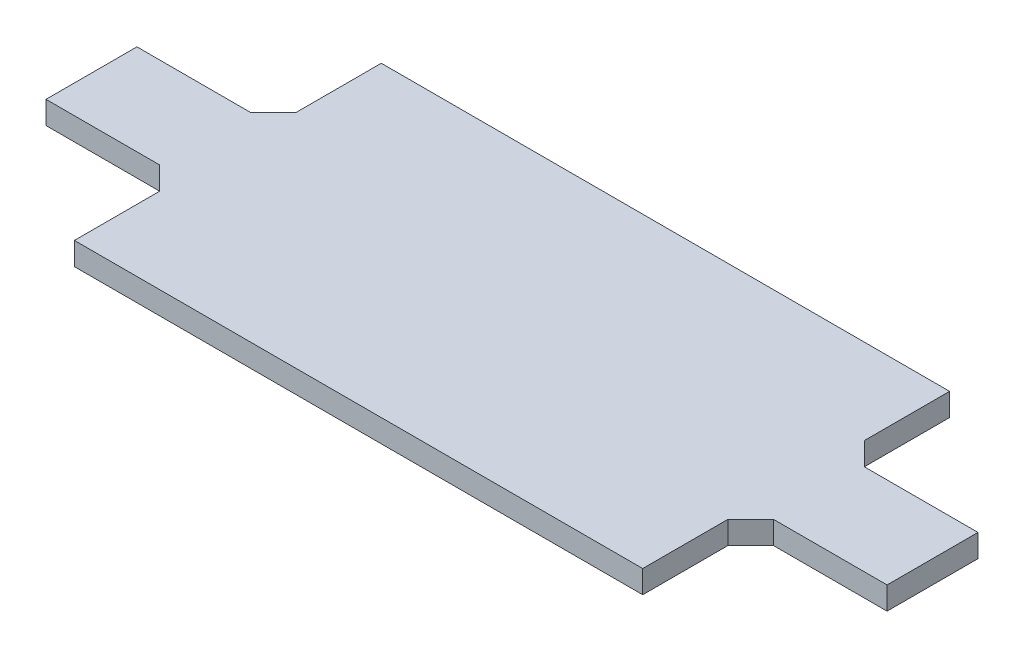
ISO-10303-21;
HEADER;
FILE_DESCRIPTION(('STEP AP214'),'2;1');
FILE_NAME('part.step','',(''),(''),'','','');
FILE_SCHEMA(('AUTOMOTIVE_DESIGN { 1 0 10303 214 1 1 1 1 }'));
ENDSEC;
DATA;
#1=APPLICATION_CONTEXT('core data for automotive mechanical design processes');
#2=APPLICATION_PROTOCOL_DEFINITION('international standard','automotive_design',2000,#1);
#3=PRODUCT_CONTEXT('',#1,'mechanical');
#4=PRODUCT('Part','Part','',(#3));
#5=PRODUCT_RELATED_PRODUCT_CATEGORY('part','',(#4));
#6=PRODUCT_DEFINITION_FORMATION('','',#4);
#7=PRODUCT_DEFINITION_CONTEXT('part definition',#1,'design');
#8=PRODUCT_DEFINITION('design','',#6,#7);
#9=PRODUCT_DEFINITION_SHAPE('','',#8);
#10=(LENGTH_UNIT() NAMED_UNIT(*) SI_UNIT(.MILLI.,.METRE.));
#11=(NAMED_UNIT(*) PLANE_ANGLE_UNIT() SI_UNIT($,.RADIAN.));
#12=(NAMED_UNIT(*) SI_UNIT($,.STERADIAN.) SOLID_ANGLE_UNIT());
#13=UNCERTAINTY_MEASURE_WITH_UNIT(LENGTH_MEASURE(1.E-05),#10,'distance_accuracy_value','');
#14=(GEOMETRIC_REPRESENTATION_CONTEXT(3) GLOBAL_UNCERTAINTY_ASSIGNED_CONTEXT((#13)) GLOBAL_UNIT_ASSIGNED_CONTEXT((#10,
#11,#12)) REPRESENTATION_CONTEXT('',''));
#15=CARTESIAN_POINT('',(0.,0.,0.));
#16=DIRECTION('',(0.,0.,1.));
#17=DIRECTION('',(1.,0.,0.));
#18=AXIS2_PLACEMENT_3D('',#15,#16,#17);
#19=CARTESIAN_POINT('',(-125.,10.,67.5));
#20=DIRECTION('',(0.,0.,-1.));
#21=DIRECTION('',(-1.,0.,0.));
#22=AXIS2_PLACEMENT_3D('',#19,#20,#21);
#23=PLANE('',#22);
#24=DIRECTION('',(1.,0.,0.));
#25=VECTOR('',#24,1.);
#26=CARTESIAN_POINT('',(-125.,0.,67.5));
#27=LINE('',#26,#25);
#28=CARTESIAN_POINT('',(-125.,0.,67.5));
#29=VERTEX_POINT('',#28);
#30=CARTESIAN_POINT('',(125.,0.,67.5));
#31=VERTEX_POINT('',#30);
#32=EDGE_CURVE('E182',#29,#31,#27,.T.);
#33=ORIENTED_EDGE('',*,*,#32,.T.);
#34=DIRECTION('',(0.,-1.,0.));
#35=VECTOR('',#34,1.);
#36=CARTESIAN_POINT('',(125.,10.,67.5));
#37=LINE('',#36,#35);
#38=CARTESIAN_POINT('',(125.,10.,67.5));
#39=VERTEX_POINT('',#38);
#40=EDGE_CURVE('E161',#39,#31,#37,.T.);
#41=ORIENTED_EDGE('',*,*,#40,.F.);
#42=DIRECTION('',(1.,0.,0.));
#43=VECTOR('',#42,1.);
#44=CARTESIAN_POINT('',(-125.,10.,67.5));
#45=LINE('',#44,#43);
#46=CARTESIAN_POINT('',(-125.,10.,67.5));
#47=VERTEX_POINT('',#46);
#48=EDGE_CURVE('E169',#47,#39,#45,.T.);
#49=ORIENTED_EDGE('',*,*,#48,.F.);
#50=DIRECTION('',(0.,-1.,0.));
#51=VECTOR('',#50,1.);
#52=CARTESIAN_POINT('',(-125.,10.,67.5));
#53=LINE('',#52,#51);
#54=EDGE_CURVE('E288',#47,#29,#53,.T.);
#55=ORIENTED_EDGE('',*,*,#54,.T.);
#56=EDGE_LOOP('',(#33,#41,#49,#55));
#57=FACE_BOUND('',#56,.T.);
#58=ADVANCED_FACE('F41',(#57),#23,.F.);
#59=CARTESIAN_POINT('',(125.,10.,20.));
#60=DIRECTION('',(-1.,0.,0.));
#61=DIRECTION('',(0.,0.,1.));
#62=AXIS2_PLACEMENT_3D('',#59,#60,#61);
#63=PLANE('',#62);
#64=DIRECTION('',(0.,0.,-1.));
#65=VECTOR('',#64,1.);
#66=CARTESIAN_POINT('',(125.,0.,20.));
#67=LINE('',#66,#65);
#68=CARTESIAN_POINT('',(125.,0.,30.));
#69=VERTEX_POINT('',#68);
#70=EDGE_CURVE('E249',#31,#69,#67,.T.);
#71=ORIENTED_EDGE('',*,*,#70,.T.);
#72=DIRECTION('',(0.,1.,0.));
#73=VECTOR('',#72,1.);
#74=CARTESIAN_POINT('',(125.,10.,30.));
#75=LINE('',#74,#73);
#76=CARTESIAN_POINT('',(125.,10.,30.));
#77=VERTEX_POINT('',#76);
#78=EDGE_CURVE('E164',#69,#77,#75,.T.);
#79=ORIENTED_EDGE('',*,*,#78,.T.);
#80=DIRECTION('',(0.,0.,-1.));
#81=VECTOR('',#80,1.);
#82=CARTESIAN_POINT('',(125.,10.,20.));
#83=LINE('',#82,#81);
#84=EDGE_CURVE('E156',#39,#77,#83,.T.);
#85=ORIENTED_EDGE('',*,*,#84,.F.);
#86=ORIENTED_EDGE('',*,*,#40,.T.);
#87=EDGE_LOOP('',(#71,#79,#85,#86));
#88=FACE_BOUND('',#87,.T.);
#89=ADVANCED_FACE('F159',(#88),#63,.F.);
#90=CARTESIAN_POINT('',(125.,10.,20.));
#91=DIRECTION('',(0.,0.,-1.));
#92=DIRECTION('',(-1.,0.,0.));
#93=AXIS2_PLACEMENT_3D('',#90,#91,#92);
#94=PLANE('',#93);
#95=DIRECTION('',(1.,0.,0.));
#96=VECTOR('',#95,1.);
#97=CARTESIAN_POINT('',(125.,10.,20.));
#98=LINE('',#97,#96);
#99=CARTESIAN_POINT('',(135.,10.,20.));
#100=VERTEX_POINT('',#99);
#101=CARTESIAN_POINT('',(185.,10.,20.));
#102=VERTEX_POINT('',#101);
#103=EDGE_CURVE('E168',#100,#102,#98,.T.);
#104=ORIENTED_EDGE('',*,*,#103,.F.);
#105=DIRECTION('',(0.,-1.,0.));
#106=VECTOR('',#105,1.);
#107=CARTESIAN_POINT('',(135.,0.,20.));
#108=LINE('',#107,#106);
#109=CARTESIAN_POINT('',(135.,0.,20.));
#110=VERTEX_POINT('',#109);
#111=EDGE_CURVE('E206',#100,#110,#108,.T.);
#112=ORIENTED_EDGE('',*,*,#111,.T.);
#113=DIRECTION('',(1.,0.,0.));
#114=VECTOR('',#113,1.);
#115=CARTESIAN_POINT('',(125.,0.,20.));
#116=LINE('',#115,#114);
#117=CARTESIAN_POINT('',(185.,0.,20.));
#118=VERTEX_POINT('',#117);
#119=EDGE_CURVE('E251',#110,#118,#116,.T.);
#120=ORIENTED_EDGE('',*,*,#119,.T.);
#121=DIRECTION('',(0.,-1.,0.));
#122=VECTOR('',#121,1.);
#123=CARTESIAN_POINT('',(185.,10.,20.));
#124=LINE('',#123,#122);
#125=EDGE_CURVE('E185',#102,#118,#124,.T.);
#126=ORIENTED_EDGE('',*,*,#125,.F.);
#127=EDGE_LOOP('',(#104,#112,#120,#126));
#128=FACE_BOUND('',#127,.T.);
#129=ADVANCED_FACE('F241',(#128),#94,.F.);
#130=CARTESIAN_POINT('',(185.,10.,20.));
#131=DIRECTION('',(-1.,0.,0.));
#132=DIRECTION('',(0.,0.,1.));
#133=AXIS2_PLACEMENT_3D('',#130,#131,#132);
#134=PLANE('',#133);
#135=DIRECTION('',(0.,0.,-1.));
#136=VECTOR('',#135,1.);
#137=CARTESIAN_POINT('',(185.,0.,20.));
#138=LINE('',#137,#136);
#139=CARTESIAN_POINT('',(185.,0.,-20.));
#140=VERTEX_POINT('',#139);
#141=EDGE_CURVE('E256',#118,#140,#138,.T.);
#142=ORIENTED_EDGE('',*,*,#141,.T.);
#143=DIRECTION('',(0.,-1.,0.));
#144=VECTOR('',#143,1.);
#145=CARTESIAN_POINT('',(185.,10.,-20.));
#146=LINE('',#145,#144);
#147=CARTESIAN_POINT('',(185.,10.,-20.));
#148=VERTEX_POINT('',#147);
#149=EDGE_CURVE('E193',#148,#140,#146,.T.);
#150=ORIENTED_EDGE('',*,*,#149,.F.);
#151=DIRECTION('',(0.,0.,-1.));
#152=VECTOR('',#151,1.);
#153=CARTESIAN_POINT('',(185.,10.,20.));
#154=LINE('',#153,#152);
#155=EDGE_CURVE('E245',#102,#148,#154,.T.);
#156=ORIENTED_EDGE('',*,*,#155,.F.);
#157=ORIENTED_EDGE('',*,*,#125,.T.);
#158=EDGE_LOOP('',(#142,#150,#156,#157));
#159=FACE_BOUND('',#158,.T.);
#160=ADVANCED_FACE('F312',(#159),#134,.F.);
#161=CARTESIAN_POINT('',(125.,10.,-20.));
#162=DIRECTION('',(0.,0.,1.));
#163=DIRECTION('',(1.,0.,0.));
#164=AXIS2_PLACEMENT_3D('',#161,#162,#163);
#165=PLANE('',#164);
#166=DIRECTION('',(-1.,0.,0.));
#167=VECTOR('',#166,1.);
#168=CARTESIAN_POINT('',(125.,0.,-20.));
#169=LINE('',#168,#167);
#170=CARTESIAN_POINT('',(135.,0.,-20.));
#171=VERTEX_POINT('',#170);
#172=EDGE_CURVE('E263',#140,#171,#169,.T.);
#173=ORIENTED_EDGE('',*,*,#172,.T.);
#174=DIRECTION('',(0.,1.,0.));
#175=VECTOR('',#174,1.);
#176=CARTESIAN_POINT('',(135.,10.,-20.));
#177=LINE('',#176,#175);
#178=CARTESIAN_POINT('',(135.,10.,-20.));
#179=VERTEX_POINT('',#178);
#180=EDGE_CURVE('E58',#171,#179,#177,.T.);
#181=ORIENTED_EDGE('',*,*,#180,.T.);
#182=DIRECTION('',(-1.,0.,0.));
#183=VECTOR('',#182,1.);
#184=CARTESIAN_POINT('',(125.,10.,-20.));
#185=LINE('',#184,#183);
#186=EDGE_CURVE('E310',#148,#179,#185,.T.);
#187=ORIENTED_EDGE('',*,*,#186,.F.);
#188=ORIENTED_EDGE('',*,*,#149,.T.);
#189=EDGE_LOOP('',(#173,#181,#187,#188));
#190=FACE_BOUND('',#189,.T.);
#191=ADVANCED_FACE('F309',(#190),#165,.F.);
#192=CARTESIAN_POINT('',(125.,10.,-67.5));
#193=DIRECTION('',(-1.,0.,0.));
#194=DIRECTION('',(0.,0.,1.));
#195=AXIS2_PLACEMENT_3D('',#192,#193,#194);
#196=PLANE('',#195);
#197=DIRECTION('',(0.,0.,-1.));
#198=VECTOR('',#197,1.);
#199=CARTESIAN_POINT('',(125.,10.,-67.5));
#200=LINE('',#199,#198);
#201=CARTESIAN_POINT('',(125.,10.,-30.0000000000001));
#202=VERTEX_POINT('',#201);
#203=CARTESIAN_POINT('',(125.,10.,-67.5));
#204=VERTEX_POINT('',#203);
#205=EDGE_CURVE('E316',#202,#204,#200,.T.);
#206=ORIENTED_EDGE('',*,*,#205,.F.);
#207=DIRECTION('',(0.,-1.,0.));
#208=VECTOR('',#207,1.);
#209=CARTESIAN_POINT('',(125.,0.,-30.0000000000001));
#210=LINE('',#209,#208);
#211=CARTESIAN_POINT('',(125.,0.,-30.0000000000001));
#212=VERTEX_POINT('',#211);
#213=EDGE_CURVE('E212',#202,#212,#210,.T.);
#214=ORIENTED_EDGE('',*,*,#213,.T.);
#215=DIRECTION('',(0.,0.,-1.));
#216=VECTOR('',#215,1.);
#217=CARTESIAN_POINT('',(125.,0.,-67.5));
#218=LINE('',#217,#216);
#219=CARTESIAN_POINT('',(125.,0.,-67.5));
#220=VERTEX_POINT('',#219);
#221=EDGE_CURVE('E266',#212,#220,#218,.T.);
#222=ORIENTED_EDGE('',*,*,#221,.T.);
#223=DIRECTION('',(0.,-1.,0.));
#224=VECTOR('',#223,1.);
#225=CARTESIAN_POINT('',(125.,10.,-67.5));
#226=LINE('',#225,#224);
#227=EDGE_CURVE('E303',#204,#220,#226,.T.);
#228=ORIENTED_EDGE('',*,*,#227,.F.);
#229=EDGE_LOOP('',(#206,#214,#222,#228));
#230=FACE_BOUND('',#229,.T.);
#231=ADVANCED_FACE('F377',(#230),#196,.F.);
#232=CARTESIAN_POINT('',(-125.,10.,-67.5));
#233=DIRECTION('',(0.,0.,1.));
#234=DIRECTION('',(1.,0.,0.));
#235=AXIS2_PLACEMENT_3D('',#232,#233,#234);
#236=PLANE('',#235);
#237=DIRECTION('',(-1.,0.,0.));
#238=VECTOR('',#237,1.);
#239=CARTESIAN_POINT('',(-125.,0.,-67.5));
#240=LINE('',#239,#238);
#241=CARTESIAN_POINT('',(-125.,0.,-67.5));
#242=VERTEX_POINT('',#241);
#243=EDGE_CURVE('E269',#220,#242,#240,.T.);
#244=ORIENTED_EDGE('',*,*,#243,.T.);
#245=DIRECTION('',(0.,-1.,0.));
#246=VECTOR('',#245,1.);
#247=CARTESIAN_POINT('',(-125.,10.,-67.5));
#248=LINE('',#247,#246);
#249=CARTESIAN_POINT('',(-125.,10.,-67.5));
#250=VERTEX_POINT('',#249);
#251=EDGE_CURVE('E299',#250,#242,#248,.T.);
#252=ORIENTED_EDGE('',*,*,#251,.F.);
#253=DIRECTION('',(-1.,0.,0.));
#254=VECTOR('',#253,1.);
#255=CARTESIAN_POINT('',(-125.,10.,-67.5));
#256=LINE('',#255,#254);
#257=EDGE_CURVE('E321',#204,#250,#256,.T.);
#258=ORIENTED_EDGE('',*,*,#257,.F.);
#259=ORIENTED_EDGE('',*,*,#227,.T.);
#260=EDGE_LOOP('',(#244,#252,#258,#259));
#261=FACE_BOUND('',#260,.T.);
#262=ADVANCED_FACE('F374',(#261),#236,.F.);
#263=CARTESIAN_POINT('',(-125.,10.,-67.5));
#264=DIRECTION('',(1.,0.,0.));
#265=DIRECTION('',(0.,0.,-1.));
#266=AXIS2_PLACEMENT_3D('',#263,#264,#265);
#267=PLANE('',#266);
#268=DIRECTION('',(0.,0.,1.));
#269=VECTOR('',#268,1.);
#270=CARTESIAN_POINT('',(-125.,0.,-67.5));
#271=LINE('',#270,#269);
#272=CARTESIAN_POINT('',(-125.,0.,-29.9999999999999));
#273=VERTEX_POINT('',#272);
#274=EDGE_CURVE('E272',#242,#273,#271,.T.);
#275=ORIENTED_EDGE('',*,*,#274,.T.);
#276=DIRECTION('',(0.,1.,0.));
#277=VECTOR('',#276,1.);
#278=CARTESIAN_POINT('',(-125.,10.,-29.9999999999999));
#279=LINE('',#278,#277);
#280=CARTESIAN_POINT('',(-125.,10.,-29.9999999999999));
#281=VERTEX_POINT('',#280);
#282=EDGE_CURVE('E203',#273,#281,#279,.T.);
#283=ORIENTED_EDGE('',*,*,#282,.T.);
#284=DIRECTION('',(0.,0.,1.));
#285=VECTOR('',#284,1.);
#286=CARTESIAN_POINT('',(-125.,10.,-67.5));
#287=LINE('',#286,#285);
#288=EDGE_CURVE('E324',#250,#281,#287,.T.);
#289=ORIENTED_EDGE('',*,*,#288,.F.);
#290=ORIENTED_EDGE('',*,*,#251,.T.);
#291=EDGE_LOOP('',(#275,#283,#289,#290));
#292=FACE_BOUND('',#291,.T.);
#293=ADVANCED_FACE('F368',(#292),#267,.F.);
#294=CARTESIAN_POINT('',(-125.,10.,-20.));
#295=DIRECTION('',(0.,0.,1.));
#296=DIRECTION('',(1.,0.,0.));
#297=AXIS2_PLACEMENT_3D('',#294,#295,#296);
#298=PLANE('',#297);
#299=DIRECTION('',(-1.,0.,0.));
#300=VECTOR('',#299,1.);
#301=CARTESIAN_POINT('',(-125.,10.,-20.));
#302=LINE('',#301,#300);
#303=CARTESIAN_POINT('',(-135.,10.,-20.));
#304=VERTEX_POINT('',#303);
#305=CARTESIAN_POINT('',(-185.,10.,-20.));
#306=VERTEX_POINT('',#305);
#307=EDGE_CURVE('E328',#304,#306,#302,.T.);
#308=ORIENTED_EDGE('',*,*,#307,.F.);
#309=DIRECTION('',(0.,-1.,0.));
#310=VECTOR('',#309,1.);
#311=CARTESIAN_POINT('',(-135.,0.,-20.));
#312=LINE('',#311,#310);
#313=CARTESIAN_POINT('',(-135.,0.,-20.));
#314=VERTEX_POINT('',#313);
#315=EDGE_CURVE('E199',#304,#314,#312,.T.);
#316=ORIENTED_EDGE('',*,*,#315,.T.);
#317=DIRECTION('',(-1.,0.,0.));
#318=VECTOR('',#317,1.);
#319=CARTESIAN_POINT('',(-125.,0.,-20.));
#320=LINE('',#319,#318);
#321=CARTESIAN_POINT('',(-185.,0.,-20.));
#322=VERTEX_POINT('',#321);
#323=EDGE_CURVE('E276',#314,#322,#320,.T.);
#324=ORIENTED_EDGE('',*,*,#323,.T.);
#325=DIRECTION('',(0.,-1.,0.));
#326=VECTOR('',#325,1.);
#327=CARTESIAN_POINT('',(-185.,10.,-20.));
#328=LINE('',#327,#326);
#329=EDGE_CURVE('E295',#306,#322,#328,.T.);
#330=ORIENTED_EDGE('',*,*,#329,.F.);
#331=EDGE_LOOP('',(#308,#316,#324,#330));
#332=FACE_BOUND('',#331,.T.);
#333=ADVANCED_FACE('F360',(#332),#298,.F.);
#334=CARTESIAN_POINT('',(-185.,10.,20.));
#335=DIRECTION('',(1.,0.,0.));
#336=DIRECTION('',(0.,0.,-1.));
#337=AXIS2_PLACEMENT_3D('',#334,#335,#336);
#338=PLANE('',#337);
#339=DIRECTION('',(0.,0.,1.));
#340=VECTOR('',#339,1.);
#341=CARTESIAN_POINT('',(-185.,0.,20.));
#342=LINE('',#341,#340);
#343=CARTESIAN_POINT('',(-185.,0.,20.));
#344=VERTEX_POINT('',#343);
#345=EDGE_CURVE('E279',#322,#344,#342,.T.);
#346=ORIENTED_EDGE('',*,*,#345,.T.);
#347=DIRECTION('',(0.,-1.,0.));
#348=VECTOR('',#347,1.);
#349=CARTESIAN_POINT('',(-185.,10.,20.));
#350=LINE('',#349,#348);
#351=CARTESIAN_POINT('',(-185.,10.,20.));
#352=VERTEX_POINT('',#351);
#353=EDGE_CURVE('E291',#352,#344,#350,.T.);
#354=ORIENTED_EDGE('',*,*,#353,.F.);
#355=DIRECTION('',(0.,0.,1.));
#356=VECTOR('',#355,1.);
#357=CARTESIAN_POINT('',(-185.,10.,20.));
#358=LINE('',#357,#356);
#359=EDGE_CURVE('E331',#306,#352,#358,.T.);
#360=ORIENTED_EDGE('',*,*,#359,.F.);
#361=ORIENTED_EDGE('',*,*,#329,.T.);
#362=EDGE_LOOP('',(#346,#354,#360,#361));
#363=FACE_BOUND('',#362,.T.);
#364=ADVANCED_FACE('F354',(#363),#338,.F.);
#365=CARTESIAN_POINT('',(-125.,10.,20.));
#366=DIRECTION('',(0.,0.,-1.));
#367=DIRECTION('',(-1.,0.,0.));
#368=AXIS2_PLACEMENT_3D('',#365,#366,#367);
#369=PLANE('',#368);
#370=DIRECTION('',(1.,0.,0.));
#371=VECTOR('',#370,1.);
#372=CARTESIAN_POINT('',(-125.,0.,20.));
#373=LINE('',#372,#371);
#374=CARTESIAN_POINT('',(-135.,0.,20.));
#375=VERTEX_POINT('',#374);
#376=EDGE_CURVE('E282',#344,#375,#373,.T.);
#377=ORIENTED_EDGE('',*,*,#376,.T.);
#378=DIRECTION('',(0.,1.,0.));
#379=VECTOR('',#378,1.);
#380=CARTESIAN_POINT('',(-135.,10.,20.));
#381=LINE('',#380,#379);
#382=CARTESIAN_POINT('',(-135.,10.,20.));
#383=VERTEX_POINT('',#382);
#384=EDGE_CURVE('E190',#375,#383,#381,.T.);
#385=ORIENTED_EDGE('',*,*,#384,.T.);
#386=DIRECTION('',(1.,0.,0.));
#387=VECTOR('',#386,1.);
#388=CARTESIAN_POINT('',(-125.,10.,20.));
#389=LINE('',#388,#387);
#390=EDGE_CURVE('E334',#352,#383,#389,.T.);
#391=ORIENTED_EDGE('',*,*,#390,.F.);
#392=ORIENTED_EDGE('',*,*,#353,.T.);
#393=EDGE_LOOP('',(#377,#385,#391,#392));
#394=FACE_BOUND('',#393,.T.);
#395=ADVANCED_FACE('F352',(#394),#369,.F.);
#396=CARTESIAN_POINT('',(-125.,10.,20.));
#397=DIRECTION('',(1.,0.,0.));
#398=DIRECTION('',(0.,0.,-1.));
#399=AXIS2_PLACEMENT_3D('',#396,#397,#398);
#400=PLANE('',#399);
#401=DIRECTION('',(0.,0.,1.));
#402=VECTOR('',#401,1.);
#403=CARTESIAN_POINT('',(-125.,10.,20.));
#404=LINE('',#403,#402);
#405=CARTESIAN_POINT('',(-125.,10.,30.0000000000001));
#406=VERTEX_POINT('',#405);
#407=EDGE_CURVE('E174',#406,#47,#404,.T.);
#408=ORIENTED_EDGE('',*,*,#407,.F.);
#409=DIRECTION('',(0.,-1.,0.));
#410=VECTOR('',#409,1.);
#411=CARTESIAN_POINT('',(-125.,0.,30.0000000000001));
#412=LINE('',#411,#410);
#413=CARTESIAN_POINT('',(-125.,0.,30.0000000000001));
#414=VERTEX_POINT('',#413);
#415=EDGE_CURVE('E184',#406,#414,#412,.T.);
#416=ORIENTED_EDGE('',*,*,#415,.T.);
#417=DIRECTION('',(0.,0.,1.));
#418=VECTOR('',#417,1.);
#419=CARTESIAN_POINT('',(-125.,0.,20.));
#420=LINE('',#419,#418);
#421=EDGE_CURVE('E179',#414,#29,#420,.T.);
#422=ORIENTED_EDGE('',*,*,#421,.T.);
#423=ORIENTED_EDGE('',*,*,#54,.F.);
#424=EDGE_LOOP('',(#408,#416,#422,#423));
#425=FACE_BOUND('',#424,.T.);
#426=ADVANCED_FACE('F349',(#425),#400,.F.);
#427=CARTESIAN_POINT('',(0.,10.,0.));
#428=DIRECTION('',(0.,-1.,0.));
#429=DIRECTION('',(0.,0.,-1.));
#430=AXIS2_PLACEMENT_3D('',#427,#428,#429);
#431=PLANE('',#430);
#432=ORIENTED_EDGE('',*,*,#48,.T.);
#433=ORIENTED_EDGE('',*,*,#84,.T.);
#434=DIRECTION('',(-0.707106781186551,0.,0.707106781186544));
#435=VECTOR('',#434,1.);
#436=CARTESIAN_POINT('',(77.4999999999993,10.,77.5000000000001));
#437=LINE('',#436,#435);
#438=EDGE_CURVE('E233',#77,#100,#437,.F.);
#439=ORIENTED_EDGE('',*,*,#438,.T.);
#440=ORIENTED_EDGE('',*,*,#103,.T.);
#441=ORIENTED_EDGE('',*,*,#155,.T.);
#442=ORIENTED_EDGE('',*,*,#186,.T.);
#443=DIRECTION('',(0.707106781186544,0.,0.707106781186552));
#444=VECTOR('',#443,1.);
#445=CARTESIAN_POINT('',(77.5000000000008,10.,-77.4999999999999));
#446=LINE('',#445,#444);
#447=EDGE_CURVE('E11',#179,#202,#446,.F.);
#448=ORIENTED_EDGE('',*,*,#447,.T.);
#449=ORIENTED_EDGE('',*,*,#205,.T.);
#450=ORIENTED_EDGE('',*,*,#257,.T.);
#451=ORIENTED_EDGE('',*,*,#288,.T.);
#452=DIRECTION('',(0.707106781186551,0.,-0.707106781186544));
#453=VECTOR('',#452,1.);
#454=CARTESIAN_POINT('',(-77.4999999999993,10.,-77.5000000000001));
#455=LINE('',#454,#453);
#456=EDGE_CURVE('E227',#281,#304,#455,.F.);
#457=ORIENTED_EDGE('',*,*,#456,.T.);
#458=ORIENTED_EDGE('',*,*,#307,.T.);
#459=ORIENTED_EDGE('',*,*,#359,.T.);
#460=ORIENTED_EDGE('',*,*,#390,.T.);
#461=DIRECTION('',(-0.707106781186544,0.,-0.707106781186551));
#462=VECTOR('',#461,1.);
#463=CARTESIAN_POINT('',(-77.5000000000007,10.,77.4999999999999));
#464=LINE('',#463,#462);
#465=EDGE_CURVE('E221',#383,#406,#464,.F.);
#466=ORIENTED_EDGE('',*,*,#465,.T.);
#467=ORIENTED_EDGE('',*,*,#407,.T.);
#468=EDGE_LOOP('',(#432,#433,#439,#440,#441,#442,#448,#449,#450,#451,#457,#458,#459,#460,#466,#467));
#469=FACE_BOUND('',#468,.T.);
#470=ADVANCED_FACE('F172',(#469),#431,.F.);
#471=CARTESIAN_POINT('',(0.,0.,0.));
#472=DIRECTION('',(0.,-1.,0.));
#473=DIRECTION('',(0.,0.,-1.));
#474=AXIS2_PLACEMENT_3D('',#471,#472,#473);
#475=PLANE('',#474);
#476=ORIENTED_EDGE('',*,*,#32,.F.);
#477=ORIENTED_EDGE('',*,*,#421,.F.);
#478=DIRECTION('',(0.707106781186544,0.,0.707106781186551));
#479=VECTOR('',#478,1.);
#480=CARTESIAN_POINT('',(-125.,0.,30.0000000000001));
#481=LINE('',#480,#479);
#482=EDGE_CURVE('E218',#414,#375,#481,.F.);
#483=ORIENTED_EDGE('',*,*,#482,.T.);
#484=ORIENTED_EDGE('',*,*,#376,.F.);
#485=ORIENTED_EDGE('',*,*,#345,.F.);
#486=ORIENTED_EDGE('',*,*,#323,.F.);
#487=DIRECTION('',(-0.707106781186551,0.,0.707106781186544));
#488=VECTOR('',#487,1.);
#489=CARTESIAN_POINT('',(-135.,0.,-20.));
#490=LINE('',#489,#488);
#491=EDGE_CURVE('E224',#314,#273,#490,.F.);
#492=ORIENTED_EDGE('',*,*,#491,.T.);
#493=ORIENTED_EDGE('',*,*,#274,.F.);
#494=ORIENTED_EDGE('',*,*,#243,.F.);
#495=ORIENTED_EDGE('',*,*,#221,.F.);
#496=DIRECTION('',(-0.707106781186544,0.,-0.707106781186552));
#497=VECTOR('',#496,1.);
#498=CARTESIAN_POINT('',(125.,0.,-30.0000000000001));
#499=LINE('',#498,#497);
#500=EDGE_CURVE('E51',#212,#171,#499,.F.);
#501=ORIENTED_EDGE('',*,*,#500,.T.);
#502=ORIENTED_EDGE('',*,*,#172,.F.);
#503=ORIENTED_EDGE('',*,*,#141,.F.);
#504=ORIENTED_EDGE('',*,*,#119,.F.);
#505=DIRECTION('',(0.707106781186551,0.,-0.707106781186544));
#506=VECTOR('',#505,1.);
#507=CARTESIAN_POINT('',(135.,0.,20.));
#508=LINE('',#507,#506);
#509=EDGE_CURVE('E230',#110,#69,#508,.F.);
#510=ORIENTED_EDGE('',*,*,#509,.T.);
#511=ORIENTED_EDGE('',*,*,#70,.F.);
#512=EDGE_LOOP('',(#476,#477,#483,#484,#485,#486,#492,#493,#494,#495,#501,#502,#503,#504,#510,#511));
#513=FACE_BOUND('',#512,.T.);
#514=ADVANCED_FACE('F248',(#513),#475,.T.);
#515=CARTESIAN_POINT('',(-125.,10.,30.0000000000001));
#516=DIRECTION('',(-0.707106781186551,0.,0.707106781186544));
#517=DIRECTION('',(0.,1.,0.));
#518=AXIS2_PLACEMENT_3D('',#515,#516,#517);
#519=PLANE('',#518);
#520=ORIENTED_EDGE('',*,*,#465,.F.);
#521=ORIENTED_EDGE('',*,*,#384,.F.);
#522=ORIENTED_EDGE('',*,*,#482,.F.);
#523=ORIENTED_EDGE('',*,*,#415,.F.);
#524=EDGE_LOOP('',(#520,#521,#522,#523));
#525=FACE_BOUND('',#524,.T.);
#526=ADVANCED_FACE('F346',(#525),#519,.T.);
#527=CARTESIAN_POINT('',(-135.,10.,-20.));
#528=DIRECTION('',(-0.707106781186544,0.,-0.707106781186551));
#529=DIRECTION('',(0.,1.,0.));
#530=AXIS2_PLACEMENT_3D('',#527,#528,#529);
#531=PLANE('',#530);
#532=ORIENTED_EDGE('',*,*,#456,.F.);
#533=ORIENTED_EDGE('',*,*,#282,.F.);
#534=ORIENTED_EDGE('',*,*,#491,.F.);
#535=ORIENTED_EDGE('',*,*,#315,.F.);
#536=EDGE_LOOP('',(#532,#533,#534,#535));
#537=FACE_BOUND('',#536,.T.);
#538=ADVANCED_FACE('F364',(#537),#531,.T.);
#539=CARTESIAN_POINT('',(135.,10.,20.));
#540=DIRECTION('',(0.707106781186544,0.,0.707106781186551));
#541=DIRECTION('',(0.,1.,0.));
#542=AXIS2_PLACEMENT_3D('',#539,#540,#541);
#543=PLANE('',#542);
#544=ORIENTED_EDGE('',*,*,#438,.F.);
#545=ORIENTED_EDGE('',*,*,#78,.F.);
#546=ORIENTED_EDGE('',*,*,#509,.F.);
#547=ORIENTED_EDGE('',*,*,#111,.F.);
#548=EDGE_LOOP('',(#544,#545,#546,#547));
#549=FACE_BOUND('',#548,.T.);
#550=ADVANCED_FACE('F247',(#549),#543,.T.);
#551=CARTESIAN_POINT('',(125.,10.,-30.0000000000001));
#552=DIRECTION('',(0.707106781186552,0.,-0.707106781186544));
#553=DIRECTION('',(0.,1.,0.));
#554=AXIS2_PLACEMENT_3D('',#551,#552,#553);
#555=PLANE('',#554);
#556=ORIENTED_EDGE('',*,*,#447,.F.);
#557=ORIENTED_EDGE('',*,*,#180,.F.);
#558=ORIENTED_EDGE('',*,*,#500,.F.);
#559=ORIENTED_EDGE('',*,*,#213,.F.);
#560=EDGE_LOOP('',(#556,#557,#558,#559));
#561=FACE_BOUND('',#560,.T.);
#562=ADVANCED_FACE('F44',(#561),#555,.T.);
#563=CLOSED_SHELL('',(#58,#89,#129,#160,#191,#231,#262,#293,#333,#364,#395,#426,#470,#514,#526,
#538,#550,#562));
#564=MANIFOLD_SOLID_BREP('B2',#563);
#565=ADVANCED_BREP_SHAPE_REPRESENTATION('',(#18,#564),#14);
#566=SHAPE_DEFINITION_REPRESENTATION(#9,#565);
ENDSEC;
END-ISO-10303-21;
